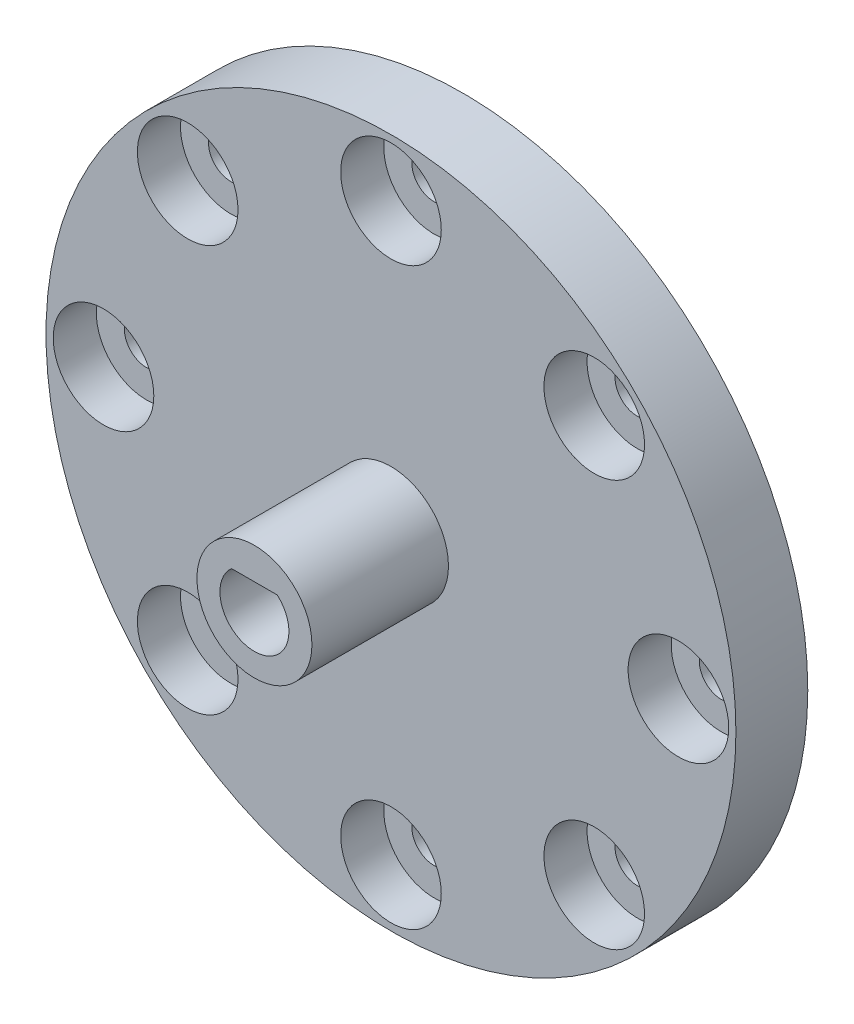
ISO-10303-21;
HEADER;
FILE_DESCRIPTION(('STEP AP214'),'2;1');
FILE_NAME('part.step','',(''),(''),'','','');
FILE_SCHEMA(('AUTOMOTIVE_DESIGN { 1 0 10303 214 1 1 1 1 }'));
ENDSEC;
DATA;
#1=APPLICATION_CONTEXT('core data for automotive mechanical design processes');
#2=APPLICATION_PROTOCOL_DEFINITION('international standard','automotive_design',2000,#1);
#3=PRODUCT_CONTEXT('',#1,'mechanical');
#4=PRODUCT('Part','Part','',(#3));
#5=PRODUCT_RELATED_PRODUCT_CATEGORY('part','',(#4));
#6=PRODUCT_DEFINITION_FORMATION('','',#4);
#7=PRODUCT_DEFINITION_CONTEXT('part definition',#1,'design');
#8=PRODUCT_DEFINITION('design','',#6,#7);
#9=PRODUCT_DEFINITION_SHAPE('','',#8);
#10=(LENGTH_UNIT() NAMED_UNIT(*) SI_UNIT(.MILLI.,.METRE.));
#11=(NAMED_UNIT(*) PLANE_ANGLE_UNIT() SI_UNIT($,.RADIAN.));
#12=(NAMED_UNIT(*) SI_UNIT($,.STERADIAN.) SOLID_ANGLE_UNIT());
#13=UNCERTAINTY_MEASURE_WITH_UNIT(LENGTH_MEASURE(1.E-05),#10,'distance_accuracy_value','');
#14=(GEOMETRIC_REPRESENTATION_CONTEXT(3) GLOBAL_UNCERTAINTY_ASSIGNED_CONTEXT((#13)) GLOBAL_UNIT_ASSIGNED_CONTEXT((#10,
#11,#12)) REPRESENTATION_CONTEXT('',''));
#15=CARTESIAN_POINT('',(0.,0.,0.));
#16=DIRECTION('',(0.,0.,1.));
#17=DIRECTION('',(1.,0.,0.));
#18=AXIS2_PLACEMENT_3D('',#15,#16,#17);
#19=CARTESIAN_POINT('',(14.1421356237307,14.1421356237303,9.38406204336157));
#20=DIRECTION('',(0.,0.,-1.));
#21=DIRECTION('',(-1.,0.,0.));
#22=AXIS2_PLACEMENT_3D('',#19,#20,#21);
#23=CYLINDRICAL_SURFACE('',#22,1.55000000000065);
#24=CARTESIAN_POINT('',(14.1421356237307,14.1421356237303,0.));
#25=DIRECTION('',(0.,0.,-1.));
#26=DIRECTION('',(-1.,0.,0.));
#27=AXIS2_PLACEMENT_3D('',#24,#25,#26);
#28=CIRCLE('',#27,1.55000000000065);
#29=CARTESIAN_POINT('',(12.5921356237301,14.1421356237303,0.));
#30=VERTEX_POINT('',#29);
#31=EDGE_CURVE('E137',#30,#30,#28,.T.);
#32=ORIENTED_EDGE('',*,*,#31,.T.);
#33=EDGE_LOOP('',(#32));
#34=FACE_BOUND('',#33,.T.);
#35=CARTESIAN_POINT('',(14.1421356237307,14.1421356237303,2.));
#36=DIRECTION('',(0.,0.,1.));
#37=DIRECTION('',(1.,0.,0.));
#38=AXIS2_PLACEMENT_3D('',#35,#36,#37);
#39=CIRCLE('',#38,1.55000000000065);
#40=CARTESIAN_POINT('',(15.6921356237314,14.1421356237303,2.));
#41=VERTEX_POINT('',#40);
#42=EDGE_CURVE('E41',#41,#41,#39,.F.);
#43=ORIENTED_EDGE('',*,*,#42,.F.);
#44=EDGE_LOOP('',(#43));
#45=FACE_BOUND('',#44,.T.);
#46=ADVANCED_FACE('F37',(#34,#45),#23,.F.);
#47=CARTESIAN_POINT('',(19.9999999999992,-8.5265128291212E-13,9.38406204336157));
#48=DIRECTION('',(0.,0.,-1.));
#49=DIRECTION('',(-1.,0.,0.));
#50=AXIS2_PLACEMENT_3D('',#47,#48,#49);
#51=CYLINDRICAL_SURFACE('',#50,1.55000000000126);
#52=CARTESIAN_POINT('',(19.9999999999992,-8.5265128291212E-13,0.));
#53=DIRECTION('',(0.,0.,-1.));
#54=DIRECTION('',(-1.,0.,0.));
#55=AXIS2_PLACEMENT_3D('',#52,#53,#54);
#56=CIRCLE('',#55,1.55000000000126);
#57=CARTESIAN_POINT('',(18.4499999999979,-8.5265128291212E-13,0.));
#58=VERTEX_POINT('',#57);
#59=EDGE_CURVE('E159',#58,#58,#56,.T.);
#60=ORIENTED_EDGE('',*,*,#59,.T.);
#61=EDGE_LOOP('',(#60));
#62=FACE_BOUND('',#61,.T.);
#63=CARTESIAN_POINT('',(19.9999999999992,-8.5265128291212E-13,2.));
#64=DIRECTION('',(0.,0.,1.));
#65=DIRECTION('',(1.,0.,0.));
#66=AXIS2_PLACEMENT_3D('',#63,#64,#65);
#67=CIRCLE('',#66,1.55000000000126);
#68=CARTESIAN_POINT('',(21.5500000000004,-8.5265128291212E-13,2.));
#69=VERTEX_POINT('',#68);
#70=EDGE_CURVE('E182',#69,#69,#67,.F.);
#71=ORIENTED_EDGE('',*,*,#70,.F.);
#72=EDGE_LOOP('',(#71));
#73=FACE_BOUND('',#72,.T.);
#74=ADVANCED_FACE('F192',(#62,#73),#51,.F.);
#75=CARTESIAN_POINT('',(14.1421356237295,-14.1421356237316,9.38406204336157));
#76=DIRECTION('',(0.,0.,-1.));
#77=DIRECTION('',(-1.,0.,0.));
#78=AXIS2_PLACEMENT_3D('',#75,#76,#77);
#79=CYLINDRICAL_SURFACE('',#78,1.55000000000173);
#80=CARTESIAN_POINT('',(14.1421356237295,-14.1421356237316,0.));
#81=DIRECTION('',(0.,0.,-1.));
#82=DIRECTION('',(-1.,0.,0.));
#83=AXIS2_PLACEMENT_3D('',#80,#81,#82);
#84=CIRCLE('',#83,1.55000000000173);
#85=CARTESIAN_POINT('',(12.5921356237278,-14.1421356237316,0.));
#86=VERTEX_POINT('',#85);
#87=EDGE_CURVE('E156',#86,#86,#84,.T.);
#88=ORIENTED_EDGE('',*,*,#87,.T.);
#89=EDGE_LOOP('',(#88));
#90=FACE_BOUND('',#89,.T.);
#91=CARTESIAN_POINT('',(14.1421356237295,-14.1421356237316,2.));
#92=DIRECTION('',(0.,0.,1.));
#93=DIRECTION('',(1.,0.,0.));
#94=AXIS2_PLACEMENT_3D('',#91,#92,#93);
#95=CIRCLE('',#94,1.55000000000173);
#96=CARTESIAN_POINT('',(15.6921356237312,-14.1421356237316,2.));
#97=VERTEX_POINT('',#96);
#98=EDGE_CURVE('E180',#97,#97,#95,.F.);
#99=ORIENTED_EDGE('',*,*,#98,.F.);
#100=EDGE_LOOP('',(#99));
#101=FACE_BOUND('',#100,.T.);
#102=ADVANCED_FACE('F198',(#90,#101),#79,.F.);
#103=CARTESIAN_POINT('',(-1.70040397862765E-12,-20.,9.38406204336157));
#104=DIRECTION('',(0.,0.,-1.));
#105=DIRECTION('',(-1.,0.,0.));
#106=AXIS2_PLACEMENT_3D('',#103,#104,#105);
#107=CYLINDRICAL_SURFACE('',#106,1.55000000000176);
#108=CARTESIAN_POINT('',(-1.70040397862765E-12,-20.,0.));
#109=DIRECTION('',(0.,0.,-1.));
#110=DIRECTION('',(-1.,0.,0.));
#111=AXIS2_PLACEMENT_3D('',#108,#109,#110);
#112=CIRCLE('',#111,1.55000000000176);
#113=CARTESIAN_POINT('',(-1.55000000000346,-20.,0.));
#114=VERTEX_POINT('',#113);
#115=EDGE_CURVE('E153',#114,#114,#112,.T.);
#116=ORIENTED_EDGE('',*,*,#115,.T.);
#117=EDGE_LOOP('',(#116));
#118=FACE_BOUND('',#117,.T.);
#119=CARTESIAN_POINT('',(-1.70040397862765E-12,-20.,2.));
#120=DIRECTION('',(0.,0.,1.));
#121=DIRECTION('',(1.,0.,0.));
#122=AXIS2_PLACEMENT_3D('',#119,#120,#121);
#123=CIRCLE('',#122,1.55000000000176);
#124=CARTESIAN_POINT('',(1.55000000000006,-20.,2.));
#125=VERTEX_POINT('',#124);
#126=EDGE_CURVE('E177',#125,#125,#123,.F.);
#127=ORIENTED_EDGE('',*,*,#126,.F.);
#128=EDGE_LOOP('',(#127));
#129=FACE_BOUND('',#128,.T.);
#130=ADVANCED_FACE('F259',(#118,#129),#107,.F.);
#131=CARTESIAN_POINT('',(-14.1421356237324,-14.1421356237303,9.38406204336157));
#132=DIRECTION('',(0.,0.,-1.));
#133=DIRECTION('',(-1.,0.,0.));
#134=AXIS2_PLACEMENT_3D('',#131,#132,#133);
#135=CYLINDRICAL_SURFACE('',#134,1.55000000000131);
#136=CARTESIAN_POINT('',(-14.1421356237324,-14.1421356237303,0.));
#137=DIRECTION('',(0.,0.,-1.));
#138=DIRECTION('',(-1.,0.,0.));
#139=AXIS2_PLACEMENT_3D('',#136,#137,#138);
#140=CIRCLE('',#139,1.55000000000131);
#141=CARTESIAN_POINT('',(-15.6921356237337,-14.1421356237303,0.));
#142=VERTEX_POINT('',#141);
#143=EDGE_CURVE('E150',#142,#142,#140,.T.);
#144=ORIENTED_EDGE('',*,*,#143,.T.);
#145=EDGE_LOOP('',(#144));
#146=FACE_BOUND('',#145,.T.);
#147=CARTESIAN_POINT('',(-14.1421356237324,-14.1421356237303,2.));
#148=DIRECTION('',(0.,0.,1.));
#149=DIRECTION('',(1.,0.,0.));
#150=AXIS2_PLACEMENT_3D('',#147,#148,#149);
#151=CIRCLE('',#150,1.55000000000131);
#152=CARTESIAN_POINT('',(-12.5921356237311,-14.1421356237303,2.));
#153=VERTEX_POINT('',#152);
#154=EDGE_CURVE('E174',#153,#153,#151,.F.);
#155=ORIENTED_EDGE('',*,*,#154,.F.);
#156=EDGE_LOOP('',(#155));
#157=FACE_BOUND('',#156,.T.);
#158=ADVANCED_FACE('F255',(#146,#157),#135,.F.);
#159=CARTESIAN_POINT('',(-20.0000000000008,8.50201989313825E-13,9.38406204336157));
#160=DIRECTION('',(0.,0.,-1.));
#161=DIRECTION('',(-1.,0.,0.));
#162=AXIS2_PLACEMENT_3D('',#159,#160,#161);
#163=CYLINDRICAL_SURFACE('',#162,1.55000000000063);
#164=CARTESIAN_POINT('',(-20.0000000000008,8.50201989313825E-13,0.));
#165=DIRECTION('',(0.,0.,-1.));
#166=DIRECTION('',(-1.,0.,0.));
#167=AXIS2_PLACEMENT_3D('',#164,#165,#166);
#168=CIRCLE('',#167,1.55000000000063);
#169=CARTESIAN_POINT('',(-21.5500000000015,8.50201989313825E-13,0.));
#170=VERTEX_POINT('',#169);
#171=EDGE_CURVE('E147',#170,#170,#168,.T.);
#172=ORIENTED_EDGE('',*,*,#171,.T.);
#173=EDGE_LOOP('',(#172));
#174=FACE_BOUND('',#173,.T.);
#175=CARTESIAN_POINT('',(-20.0000000000008,8.50201989313825E-13,2.));
#176=DIRECTION('',(0.,0.,1.));
#177=DIRECTION('',(1.,0.,0.));
#178=AXIS2_PLACEMENT_3D('',#175,#176,#177);
#179=CIRCLE('',#178,1.55000000000063);
#180=CARTESIAN_POINT('',(-18.4500000000002,8.50201989313825E-13,2.));
#181=VERTEX_POINT('',#180);
#182=EDGE_CURVE('E171',#181,#181,#179,.F.);
#183=ORIENTED_EDGE('',*,*,#182,.F.);
#184=EDGE_LOOP('',(#183));
#185=FACE_BOUND('',#184,.T.);
#186=ADVANCED_FACE('F247',(#174,#185),#163,.F.);
#187=CARTESIAN_POINT('',(-14.1421356237312,14.1421356237316,9.38406204336157));
#188=DIRECTION('',(0.,0.,-1.));
#189=DIRECTION('',(-1.,0.,0.));
#190=AXIS2_PLACEMENT_3D('',#187,#188,#189);
#191=CYLINDRICAL_SURFACE('',#190,1.5500000000001);
#192=CARTESIAN_POINT('',(-14.1421356237312,14.1421356237316,0.));
#193=DIRECTION('',(0.,0.,-1.));
#194=DIRECTION('',(-1.,0.,0.));
#195=AXIS2_PLACEMENT_3D('',#192,#193,#194);
#196=CIRCLE('',#195,1.5500000000001);
#197=CARTESIAN_POINT('',(-15.6921356237313,14.1421356237316,0.));
#198=VERTEX_POINT('',#197);
#199=EDGE_CURVE('E144',#198,#198,#196,.T.);
#200=ORIENTED_EDGE('',*,*,#199,.T.);
#201=EDGE_LOOP('',(#200));
#202=FACE_BOUND('',#201,.T.);
#203=CARTESIAN_POINT('',(-14.1421356237312,14.1421356237316,2.));
#204=DIRECTION('',(0.,0.,1.));
#205=DIRECTION('',(1.,0.,0.));
#206=AXIS2_PLACEMENT_3D('',#203,#204,#205);
#207=CIRCLE('',#206,1.5500000000001);
#208=CARTESIAN_POINT('',(-12.5921356237311,14.1421356237316,2.));
#209=VERTEX_POINT('',#208);
#210=EDGE_CURVE('E168',#209,#209,#207,.F.);
#211=ORIENTED_EDGE('',*,*,#210,.F.);
#212=EDGE_LOOP('',(#211));
#213=FACE_BOUND('',#212,.T.);
#214=ADVANCED_FACE('F239',(#202,#213),#191,.F.);
#215=CARTESIAN_POINT('',(0.,20.,9.38406204336157));
#216=DIRECTION('',(0.,0.,-1.));
#217=DIRECTION('',(-1.,0.,0.));
#218=AXIS2_PLACEMENT_3D('',#215,#216,#217);
#219=CYLINDRICAL_SURFACE('',#218,1.55);
#220=CARTESIAN_POINT('',(0.,20.,0.));
#221=DIRECTION('',(0.,0.,-1.));
#222=DIRECTION('',(-1.,0.,0.));
#223=AXIS2_PLACEMENT_3D('',#220,#221,#222);
#224=CIRCLE('',#223,1.55);
#225=CARTESIAN_POINT('',(-1.55,20.,0.));
#226=VERTEX_POINT('',#225);
#227=EDGE_CURVE('E141',#226,#226,#224,.T.);
#228=ORIENTED_EDGE('',*,*,#227,.T.);
#229=EDGE_LOOP('',(#228));
#230=FACE_BOUND('',#229,.T.);
#231=CARTESIAN_POINT('',(0.,20.,2.));
#232=DIRECTION('',(0.,0.,1.));
#233=DIRECTION('',(1.,0.,0.));
#234=AXIS2_PLACEMENT_3D('',#231,#232,#233);
#235=CIRCLE('',#234,1.55);
#236=CARTESIAN_POINT('',(1.55,20.,2.));
#237=VERTEX_POINT('',#236);
#238=EDGE_CURVE('E131',#237,#237,#235,.F.);
#239=ORIENTED_EDGE('',*,*,#238,.F.);
#240=EDGE_LOOP('',(#239));
#241=FACE_BOUND('',#240,.T.);
#242=ADVANCED_FACE('F234',(#230,#241),#219,.F.);
#243=CARTESIAN_POINT('',(0.,0.,5.));
#244=DIRECTION('',(0.,0.,-1.));
#245=DIRECTION('',(-1.,0.,0.));
#246=AXIS2_PLACEMENT_3D('',#243,#244,#245);
#247=CYLINDRICAL_SURFACE('',#246,24.);
#248=CARTESIAN_POINT('',(0.,0.,5.));
#249=DIRECTION('',(0.,0.,1.));
#250=DIRECTION('',(1.,0.,0.));
#251=AXIS2_PLACEMENT_3D('',#248,#249,#250);
#252=CIRCLE('',#251,24.);
#253=CARTESIAN_POINT('',(24.,0.,5.));
#254=VERTEX_POINT('',#253);
#255=EDGE_CURVE('E11',#254,#254,#252,.T.);
#256=ORIENTED_EDGE('',*,*,#255,.F.);
#257=EDGE_LOOP('',(#256));
#258=FACE_BOUND('',#257,.T.);
#259=CARTESIAN_POINT('',(0.,0.,0.));
#260=DIRECTION('',(0.,0.,1.));
#261=DIRECTION('',(1.,0.,0.));
#262=AXIS2_PLACEMENT_3D('',#259,#260,#261);
#263=CIRCLE('',#262,24.);
#264=CARTESIAN_POINT('',(24.,0.,0.));
#265=VERTEX_POINT('',#264);
#266=EDGE_CURVE('E46',#265,#265,#263,.T.);
#267=ORIENTED_EDGE('',*,*,#266,.T.);
#268=EDGE_LOOP('',(#267));
#269=FACE_BOUND('',#268,.T.);
#270=ADVANCED_FACE('F39',(#258,#269),#247,.T.);
#271=CARTESIAN_POINT('',(0.,0.,5.));
#272=DIRECTION('',(0.,0.,1.));
#273=DIRECTION('',(1.,0.,0.));
#274=AXIS2_PLACEMENT_3D('',#271,#272,#273);
#275=PLANE('',#274);
#276=CARTESIAN_POINT('',(-14.1421356237307,14.1421356237303,5.));
#277=DIRECTION('',(0.,0.,1.));
#278=DIRECTION('',(1.,0.,0.));
#279=AXIS2_PLACEMENT_3D('',#276,#277,#278);
#280=CIRCLE('',#279,3.50000000000065);
#281=CARTESIAN_POINT('',(-10.6421356237301,14.1421356237303,5.));
#282=VERTEX_POINT('',#281);
#283=EDGE_CURVE('E70',#282,#282,#280,.T.);
#284=ORIENTED_EDGE('',*,*,#283,.F.);
#285=EDGE_LOOP('',(#284));
#286=FACE_BOUND('',#285,.T.);
#287=CARTESIAN_POINT('',(-19.9999999999992,-8.5265128291212E-13,5.));
#288=DIRECTION('',(0.,0.,1.));
#289=DIRECTION('',(1.,0.,0.));
#290=AXIS2_PLACEMENT_3D('',#287,#288,#289);
#291=CIRCLE('',#290,3.50000000000126);
#292=CARTESIAN_POINT('',(-16.4999999999979,-8.5265128291212E-13,5.));
#293=VERTEX_POINT('',#292);
#294=EDGE_CURVE('E120',#293,#293,#291,.T.);
#295=ORIENTED_EDGE('',*,*,#294,.F.);
#296=EDGE_LOOP('',(#295));
#297=FACE_BOUND('',#296,.T.);
#298=CARTESIAN_POINT('',(-14.1421356237295,-14.1421356237316,5.));
#299=DIRECTION('',(0.,0.,1.));
#300=DIRECTION('',(1.,0.,0.));
#301=AXIS2_PLACEMENT_3D('',#298,#299,#300);
#302=CIRCLE('',#301,3.50000000000173);
#303=CARTESIAN_POINT('',(-10.6421356237278,-14.1421356237316,5.));
#304=VERTEX_POINT('',#303);
#305=EDGE_CURVE('E114',#304,#304,#302,.T.);
#306=ORIENTED_EDGE('',*,*,#305,.F.);
#307=EDGE_LOOP('',(#306));
#308=FACE_BOUND('',#307,.T.);
#309=CARTESIAN_POINT('',(1.70040397862765E-12,-20.,5.));
#310=DIRECTION('',(0.,0.,1.));
#311=DIRECTION('',(1.,0.,0.));
#312=AXIS2_PLACEMENT_3D('',#309,#310,#311);
#313=CIRCLE('',#312,3.50000000000176);
#314=CARTESIAN_POINT('',(3.50000000000346,-20.,5.));
#315=VERTEX_POINT('',#314);
#316=EDGE_CURVE('E108',#315,#315,#313,.T.);
#317=ORIENTED_EDGE('',*,*,#316,.F.);
#318=EDGE_LOOP('',(#317));
#319=FACE_BOUND('',#318,.T.);
#320=CARTESIAN_POINT('',(14.1421356237324,-14.1421356237303,5.));
#321=DIRECTION('',(0.,0.,1.));
#322=DIRECTION('',(1.,0.,0.));
#323=AXIS2_PLACEMENT_3D('',#320,#321,#322);
#324=CIRCLE('',#323,3.50000000000131);
#325=CARTESIAN_POINT('',(17.6421356237337,-14.1421356237303,5.));
#326=VERTEX_POINT('',#325);
#327=EDGE_CURVE('E102',#326,#326,#324,.T.);
#328=ORIENTED_EDGE('',*,*,#327,.F.);
#329=EDGE_LOOP('',(#328));
#330=FACE_BOUND('',#329,.T.);
#331=CARTESIAN_POINT('',(20.0000000000008,8.50201989313825E-13,5.));
#332=DIRECTION('',(0.,0.,1.));
#333=DIRECTION('',(1.,0.,0.));
#334=AXIS2_PLACEMENT_3D('',#331,#332,#333);
#335=CIRCLE('',#334,3.50000000000063);
#336=CARTESIAN_POINT('',(23.5000000000015,8.50201989313825E-13,5.));
#337=VERTEX_POINT('',#336);
#338=EDGE_CURVE('E96',#337,#337,#335,.T.);
#339=ORIENTED_EDGE('',*,*,#338,.F.);
#340=EDGE_LOOP('',(#339));
#341=FACE_BOUND('',#340,.T.);
#342=CARTESIAN_POINT('',(14.1421356237312,14.1421356237316,5.));
#343=DIRECTION('',(0.,0.,1.));
#344=DIRECTION('',(1.,0.,0.));
#345=AXIS2_PLACEMENT_3D('',#342,#343,#344);
#346=CIRCLE('',#345,3.5000000000001);
#347=CARTESIAN_POINT('',(17.6421356237313,14.1421356237316,5.));
#348=VERTEX_POINT('',#347);
#349=EDGE_CURVE('E90',#348,#348,#346,.T.);
#350=ORIENTED_EDGE('',*,*,#349,.F.);
#351=EDGE_LOOP('',(#350));
#352=FACE_BOUND('',#351,.T.);
#353=CARTESIAN_POINT('',(0.,20.,5.));
#354=DIRECTION('',(0.,0.,1.));
#355=DIRECTION('',(1.,0.,0.));
#356=AXIS2_PLACEMENT_3D('',#353,#354,#355);
#357=CIRCLE('',#356,3.5);
#358=CARTESIAN_POINT('',(3.5,20.,5.));
#359=VERTEX_POINT('',#358);
#360=EDGE_CURVE('E89',#359,#359,#357,.T.);
#361=ORIENTED_EDGE('',*,*,#360,.F.);
#362=EDGE_LOOP('',(#361));
#363=FACE_BOUND('',#362,.T.);
#364=CARTESIAN_POINT('',(0.,0.,5.));
#365=DIRECTION('',(0.,0.,1.));
#366=DIRECTION('',(1.,0.,0.));
#367=AXIS2_PLACEMENT_3D('',#364,#365,#366);
#368=CIRCLE('',#367,4.);
#369=CARTESIAN_POINT('',(4.,0.,5.));
#370=VERTEX_POINT('',#369);
#371=EDGE_CURVE('E138',#370,#370,#368,.T.);
#372=ORIENTED_EDGE('',*,*,#371,.F.);
#373=EDGE_LOOP('',(#372));
#374=FACE_BOUND('',#373,.T.);
#375=ORIENTED_EDGE('',*,*,#255,.T.);
#376=EDGE_LOOP('',(#375));
#377=FACE_BOUND('',#376,.T.);
#378=ADVANCED_FACE('F203',(#286,#297,#308,#319,#330,#341,#352,#363,#374,#377),#275,.T.);
#379=CARTESIAN_POINT('',(0.,0.,0.));
#380=DIRECTION('',(0.,0.,1.));
#381=DIRECTION('',(1.,0.,0.));
#382=AXIS2_PLACEMENT_3D('',#379,#380,#381);
#383=PLANE('',#382);
#384=ORIENTED_EDGE('',*,*,#227,.F.);
#385=EDGE_LOOP('',(#384));
#386=FACE_BOUND('',#385,.T.);
#387=ORIENTED_EDGE('',*,*,#199,.F.);
#388=EDGE_LOOP('',(#387));
#389=FACE_BOUND('',#388,.T.);
#390=ORIENTED_EDGE('',*,*,#171,.F.);
#391=EDGE_LOOP('',(#390));
#392=FACE_BOUND('',#391,.T.);
#393=ORIENTED_EDGE('',*,*,#143,.F.);
#394=EDGE_LOOP('',(#393));
#395=FACE_BOUND('',#394,.T.);
#396=ORIENTED_EDGE('',*,*,#115,.F.);
#397=EDGE_LOOP('',(#396));
#398=FACE_BOUND('',#397,.T.);
#399=ORIENTED_EDGE('',*,*,#87,.F.);
#400=EDGE_LOOP('',(#399));
#401=FACE_BOUND('',#400,.T.);
#402=ORIENTED_EDGE('',*,*,#59,.F.);
#403=EDGE_LOOP('',(#402));
#404=FACE_BOUND('',#403,.T.);
#405=ORIENTED_EDGE('',*,*,#31,.F.);
#406=EDGE_LOOP('',(#405));
#407=FACE_BOUND('',#406,.T.);
#408=ORIENTED_EDGE('',*,*,#266,.F.);
#409=EDGE_LOOP('',(#408));
#410=FACE_BOUND('',#409,.T.);
#411=ADVANCED_FACE('F205',(#386,#389,#392,#395,#398,#401,#404,#407,#410),#383,.F.);
#412=CARTESIAN_POINT('',(0.,0.,14.5));
#413=DIRECTION('',(0.,0.,-1.));
#414=DIRECTION('',(-1.,0.,0.));
#415=AXIS2_PLACEMENT_3D('',#412,#413,#414);
#416=CYLINDRICAL_SURFACE('',#415,4.);
#417=CARTESIAN_POINT('',(0.,0.,14.5));
#418=DIRECTION('',(0.,0.,1.));
#419=DIRECTION('',(1.,0.,0.));
#420=AXIS2_PLACEMENT_3D('',#417,#418,#419);
#421=CIRCLE('',#420,4.);
#422=CARTESIAN_POINT('',(4.,0.,14.5));
#423=VERTEX_POINT('',#422);
#424=EDGE_CURVE('E134',#423,#423,#421,.T.);
#425=ORIENTED_EDGE('',*,*,#424,.F.);
#426=EDGE_LOOP('',(#425));
#427=FACE_BOUND('',#426,.T.);
#428=ORIENTED_EDGE('',*,*,#371,.T.);
#429=EDGE_LOOP('',(#428));
#430=FACE_BOUND('',#429,.T.);
#431=ADVANCED_FACE('F208',(#427,#430),#416,.T.);
#432=CARTESIAN_POINT('',(0.,0.,14.5));
#433=DIRECTION('',(0.,0.,1.));
#434=DIRECTION('',(1.,0.,0.));
#435=AXIS2_PLACEMENT_3D('',#432,#433,#434);
#436=PLANE('',#435);
#437=CARTESIAN_POINT('',(0.,0.,14.5));
#438=DIRECTION('',(0.,0.,1.));
#439=DIRECTION('',(1.,0.,0.));
#440=AXIS2_PLACEMENT_3D('',#437,#438,#439);
#441=CIRCLE('',#440,2.4);
#442=CARTESIAN_POINT('',(-1.58745078663875,1.8,14.5));
#443=VERTEX_POINT('',#442);
#444=CARTESIAN_POINT('',(1.58745078663875,1.8,14.5));
#445=VERTEX_POINT('',#444);
#446=EDGE_CURVE('E54',#443,#445,#441,.T.);
#447=ORIENTED_EDGE('',*,*,#446,.F.);
#448=DIRECTION('',(-1.,0.,0.));
#449=VECTOR('',#448,1.);
#450=CARTESIAN_POINT('',(-1.58745078663875,1.8,14.5));
#451=LINE('',#450,#449);
#452=EDGE_CURVE('E74',#445,#443,#451,.T.);
#453=ORIENTED_EDGE('',*,*,#452,.F.);
#454=EDGE_LOOP('',(#447,#453));
#455=FACE_BOUND('',#454,.T.);
#456=ORIENTED_EDGE('',*,*,#424,.T.);
#457=EDGE_LOOP('',(#456));
#458=FACE_BOUND('',#457,.T.);
#459=ADVANCED_FACE('F78',(#455,#458),#436,.T.);
#460=CARTESIAN_POINT('',(0.,20.,2.));
#461=DIRECTION('',(0.,0.,1.));
#462=DIRECTION('',(1.,0.,0.));
#463=AXIS2_PLACEMENT_3D('',#460,#461,#462);
#464=PLANE('',#463);
#465=CARTESIAN_POINT('',(0.,20.,2.));
#466=DIRECTION('',(0.,0.,1.));
#467=DIRECTION('',(1.,0.,0.));
#468=AXIS2_PLACEMENT_3D('',#465,#466,#467);
#469=CIRCLE('',#468,3.5);
#470=CARTESIAN_POINT('',(3.5,20.,2.));
#471=VERTEX_POINT('',#470);
#472=EDGE_CURVE('E128',#471,#471,#469,.T.);
#473=ORIENTED_EDGE('',*,*,#472,.T.);
#474=EDGE_LOOP('',(#473));
#475=FACE_BOUND('',#474,.T.);
#476=ORIENTED_EDGE('',*,*,#238,.T.);
#477=EDGE_LOOP('',(#476));
#478=FACE_BOUND('',#477,.T.);
#479=ADVANCED_FACE('F318',(#475,#478),#464,.T.);
#480=CARTESIAN_POINT('',(0.,20.,2.));
#481=DIRECTION('',(0.,0.,1.));
#482=DIRECTION('',(1.,0.,0.));
#483=AXIS2_PLACEMENT_3D('',#480,#481,#482);
#484=CYLINDRICAL_SURFACE('',#483,3.5);
#485=ORIENTED_EDGE('',*,*,#472,.F.);
#486=EDGE_LOOP('',(#485));
#487=FACE_BOUND('',#486,.T.);
#488=ORIENTED_EDGE('',*,*,#360,.T.);
#489=EDGE_LOOP('',(#488));
#490=FACE_BOUND('',#489,.T.);
#491=ADVANCED_FACE('F313',(#487,#490),#484,.F.);
#492=CARTESIAN_POINT('',(-14.1421356237307,14.1421356237303,2.));
#493=DIRECTION('',(0.,0.,1.));
#494=DIRECTION('',(1.,0.,0.));
#495=AXIS2_PLACEMENT_3D('',#492,#493,#494);
#496=PLANE('',#495);
#497=CARTESIAN_POINT('',(-14.1421356237307,14.1421356237303,2.));
#498=DIRECTION('',(0.,0.,1.));
#499=DIRECTION('',(1.,0.,0.));
#500=AXIS2_PLACEMENT_3D('',#497,#498,#499);
#501=CIRCLE('',#500,3.50000000000065);
#502=CARTESIAN_POINT('',(-10.6421356237301,14.1421356237303,2.));
#503=VERTEX_POINT('',#502);
#504=EDGE_CURVE('E123',#503,#503,#501,.T.);
#505=ORIENTED_EDGE('',*,*,#504,.T.);
#506=EDGE_LOOP('',(#505));
#507=FACE_BOUND('',#506,.T.);
#508=ORIENTED_EDGE('',*,*,#210,.T.);
#509=EDGE_LOOP('',(#508));
#510=FACE_BOUND('',#509,.T.);
#511=ADVANCED_FACE('F310',(#507,#510),#496,.T.);
#512=CARTESIAN_POINT('',(-14.1421356237307,14.1421356237303,2.));
#513=DIRECTION('',(0.,0.,1.));
#514=DIRECTION('',(1.,0.,0.));
#515=AXIS2_PLACEMENT_3D('',#512,#513,#514);
#516=CYLINDRICAL_SURFACE('',#515,3.50000000000065);
#517=ORIENTED_EDGE('',*,*,#504,.F.);
#518=EDGE_LOOP('',(#517));
#519=FACE_BOUND('',#518,.T.);
#520=ORIENTED_EDGE('',*,*,#283,.T.);
#521=EDGE_LOOP('',(#520));
#522=FACE_BOUND('',#521,.T.);
#523=ADVANCED_FACE('F305',(#519,#522),#516,.F.);
#524=CARTESIAN_POINT('',(-19.9999999999992,-8.5265128291212E-13,2.));
#525=DIRECTION('',(0.,0.,1.));
#526=DIRECTION('',(1.,0.,0.));
#527=AXIS2_PLACEMENT_3D('',#524,#525,#526);
#528=PLANE('',#527);
#529=CARTESIAN_POINT('',(-19.9999999999992,-8.5265128291212E-13,2.));
#530=DIRECTION('',(0.,0.,1.));
#531=DIRECTION('',(1.,0.,0.));
#532=AXIS2_PLACEMENT_3D('',#529,#530,#531);
#533=CIRCLE('',#532,3.50000000000126);
#534=CARTESIAN_POINT('',(-16.4999999999979,-8.5265128291212E-13,2.));
#535=VERTEX_POINT('',#534);
#536=EDGE_CURVE('E117',#535,#535,#533,.T.);
#537=ORIENTED_EDGE('',*,*,#536,.T.);
#538=EDGE_LOOP('',(#537));
#539=FACE_BOUND('',#538,.T.);
#540=ORIENTED_EDGE('',*,*,#182,.T.);
#541=EDGE_LOOP('',(#540));
#542=FACE_BOUND('',#541,.T.);
#543=ADVANCED_FACE('F302',(#539,#542),#528,.T.);
#544=CARTESIAN_POINT('',(-19.9999999999992,-8.5265128291212E-13,2.));
#545=DIRECTION('',(0.,0.,1.));
#546=DIRECTION('',(1.,0.,0.));
#547=AXIS2_PLACEMENT_3D('',#544,#545,#546);
#548=CYLINDRICAL_SURFACE('',#547,3.50000000000126);
#549=ORIENTED_EDGE('',*,*,#536,.F.);
#550=EDGE_LOOP('',(#549));
#551=FACE_BOUND('',#550,.T.);
#552=ORIENTED_EDGE('',*,*,#294,.T.);
#553=EDGE_LOOP('',(#552));
#554=FACE_BOUND('',#553,.T.);
#555=ADVANCED_FACE('F297',(#551,#554),#548,.F.);
#556=CARTESIAN_POINT('',(-14.1421356237295,-14.1421356237316,2.));
#557=DIRECTION('',(0.,0.,1.));
#558=DIRECTION('',(1.,0.,0.));
#559=AXIS2_PLACEMENT_3D('',#556,#557,#558);
#560=PLANE('',#559);
#561=CARTESIAN_POINT('',(-14.1421356237295,-14.1421356237316,2.));
#562=DIRECTION('',(0.,0.,1.));
#563=DIRECTION('',(1.,0.,0.));
#564=AXIS2_PLACEMENT_3D('',#561,#562,#563);
#565=CIRCLE('',#564,3.50000000000173);
#566=CARTESIAN_POINT('',(-10.6421356237278,-14.1421356237316,2.));
#567=VERTEX_POINT('',#566);
#568=EDGE_CURVE('E111',#567,#567,#565,.T.);
#569=ORIENTED_EDGE('',*,*,#568,.T.);
#570=EDGE_LOOP('',(#569));
#571=FACE_BOUND('',#570,.T.);
#572=ORIENTED_EDGE('',*,*,#154,.T.);
#573=EDGE_LOOP('',(#572));
#574=FACE_BOUND('',#573,.T.);
#575=ADVANCED_FACE('F294',(#571,#574),#560,.T.);
#576=CARTESIAN_POINT('',(-14.1421356237295,-14.1421356237316,2.));
#577=DIRECTION('',(0.,0.,1.));
#578=DIRECTION('',(1.,0.,0.));
#579=AXIS2_PLACEMENT_3D('',#576,#577,#578);
#580=CYLINDRICAL_SURFACE('',#579,3.50000000000173);
#581=ORIENTED_EDGE('',*,*,#568,.F.);
#582=EDGE_LOOP('',(#581));
#583=FACE_BOUND('',#582,.T.);
#584=ORIENTED_EDGE('',*,*,#305,.T.);
#585=EDGE_LOOP('',(#584));
#586=FACE_BOUND('',#585,.T.);
#587=ADVANCED_FACE('F291',(#583,#586),#580,.F.);
#588=CARTESIAN_POINT('',(1.70040397862765E-12,-20.,2.));
#589=DIRECTION('',(0.,0.,1.));
#590=DIRECTION('',(1.,0.,0.));
#591=AXIS2_PLACEMENT_3D('',#588,#589,#590);
#592=PLANE('',#591);
#593=CARTESIAN_POINT('',(1.70040397862765E-12,-20.,2.));
#594=DIRECTION('',(0.,0.,1.));
#595=DIRECTION('',(1.,0.,0.));
#596=AXIS2_PLACEMENT_3D('',#593,#594,#595);
#597=CIRCLE('',#596,3.50000000000176);
#598=CARTESIAN_POINT('',(3.50000000000346,-20.,2.));
#599=VERTEX_POINT('',#598);
#600=EDGE_CURVE('E105',#599,#599,#597,.T.);
#601=ORIENTED_EDGE('',*,*,#600,.T.);
#602=EDGE_LOOP('',(#601));
#603=FACE_BOUND('',#602,.T.);
#604=ORIENTED_EDGE('',*,*,#126,.T.);
#605=EDGE_LOOP('',(#604));
#606=FACE_BOUND('',#605,.T.);
#607=ADVANCED_FACE('F283',(#603,#606),#592,.T.);
#608=CARTESIAN_POINT('',(1.70040397862765E-12,-20.,2.));
#609=DIRECTION('',(0.,0.,1.));
#610=DIRECTION('',(1.,0.,0.));
#611=AXIS2_PLACEMENT_3D('',#608,#609,#610);
#612=CYLINDRICAL_SURFACE('',#611,3.50000000000176);
#613=ORIENTED_EDGE('',*,*,#600,.F.);
#614=EDGE_LOOP('',(#613));
#615=FACE_BOUND('',#614,.T.);
#616=ORIENTED_EDGE('',*,*,#316,.T.);
#617=EDGE_LOOP('',(#616));
#618=FACE_BOUND('',#617,.T.);
#619=ADVANCED_FACE('F273',(#615,#618),#612,.F.);
#620=CARTESIAN_POINT('',(14.1421356237324,-14.1421356237303,2.));
#621=DIRECTION('',(0.,0.,1.));
#622=DIRECTION('',(1.,0.,0.));
#623=AXIS2_PLACEMENT_3D('',#620,#621,#622);
#624=PLANE('',#623);
#625=CARTESIAN_POINT('',(14.1421356237324,-14.1421356237303,2.));
#626=DIRECTION('',(0.,0.,1.));
#627=DIRECTION('',(1.,0.,0.));
#628=AXIS2_PLACEMENT_3D('',#625,#626,#627);
#629=CIRCLE('',#628,3.50000000000131);
#630=CARTESIAN_POINT('',(17.6421356237337,-14.1421356237303,2.));
#631=VERTEX_POINT('',#630);
#632=EDGE_CURVE('E99',#631,#631,#629,.T.);
#633=ORIENTED_EDGE('',*,*,#632,.T.);
#634=EDGE_LOOP('',(#633));
#635=FACE_BOUND('',#634,.T.);
#636=ORIENTED_EDGE('',*,*,#98,.T.);
#637=EDGE_LOOP('',(#636));
#638=FACE_BOUND('',#637,.T.);
#639=ADVANCED_FACE('F270',(#635,#638),#624,.T.);
#640=CARTESIAN_POINT('',(14.1421356237324,-14.1421356237303,2.));
#641=DIRECTION('',(0.,0.,1.));
#642=DIRECTION('',(1.,0.,0.));
#643=AXIS2_PLACEMENT_3D('',#640,#641,#642);
#644=CYLINDRICAL_SURFACE('',#643,3.50000000000131);
#645=ORIENTED_EDGE('',*,*,#632,.F.);
#646=EDGE_LOOP('',(#645));
#647=FACE_BOUND('',#646,.T.);
#648=ORIENTED_EDGE('',*,*,#327,.T.);
#649=EDGE_LOOP('',(#648));
#650=FACE_BOUND('',#649,.T.);
#651=ADVANCED_FACE('F272',(#647,#650),#644,.F.);
#652=CARTESIAN_POINT('',(20.0000000000008,8.50201989313825E-13,2.));
#653=DIRECTION('',(0.,0.,1.));
#654=DIRECTION('',(1.,0.,0.));
#655=AXIS2_PLACEMENT_3D('',#652,#653,#654);
#656=PLANE('',#655);
#657=CARTESIAN_POINT('',(20.0000000000008,8.50201989313825E-13,2.));
#658=DIRECTION('',(0.,0.,1.));
#659=DIRECTION('',(1.,0.,0.));
#660=AXIS2_PLACEMENT_3D('',#657,#658,#659);
#661=CIRCLE('',#660,3.50000000000063);
#662=CARTESIAN_POINT('',(23.5000000000015,8.50201989313825E-13,2.));
#663=VERTEX_POINT('',#662);
#664=EDGE_CURVE('E93',#663,#663,#661,.T.);
#665=ORIENTED_EDGE('',*,*,#664,.T.);
#666=EDGE_LOOP('',(#665));
#667=FACE_BOUND('',#666,.T.);
#668=ORIENTED_EDGE('',*,*,#70,.T.);
#669=EDGE_LOOP('',(#668));
#670=FACE_BOUND('',#669,.T.);
#671=ADVANCED_FACE('F280',(#667,#670),#656,.T.);
#672=CARTESIAN_POINT('',(20.0000000000008,8.50201989313825E-13,2.));
#673=DIRECTION('',(0.,0.,1.));
#674=DIRECTION('',(1.,0.,0.));
#675=AXIS2_PLACEMENT_3D('',#672,#673,#674);
#676=CYLINDRICAL_SURFACE('',#675,3.50000000000063);
#677=ORIENTED_EDGE('',*,*,#664,.F.);
#678=EDGE_LOOP('',(#677));
#679=FACE_BOUND('',#678,.T.);
#680=ORIENTED_EDGE('',*,*,#338,.T.);
#681=EDGE_LOOP('',(#680));
#682=FACE_BOUND('',#681,.T.);
#683=ADVANCED_FACE('F287',(#679,#682),#676,.F.);
#684=CARTESIAN_POINT('',(14.1421356237312,14.1421356237316,2.));
#685=DIRECTION('',(0.,0.,1.));
#686=DIRECTION('',(1.,0.,0.));
#687=AXIS2_PLACEMENT_3D('',#684,#685,#686);
#688=PLANE('',#687);
#689=CARTESIAN_POINT('',(14.1421356237312,14.1421356237316,2.));
#690=DIRECTION('',(0.,0.,1.));
#691=DIRECTION('',(1.,0.,0.));
#692=AXIS2_PLACEMENT_3D('',#689,#690,#691);
#693=CIRCLE('',#692,3.5000000000001);
#694=CARTESIAN_POINT('',(17.6421356237313,14.1421356237316,2.));
#695=VERTEX_POINT('',#694);
#696=EDGE_CURVE('E86',#695,#695,#693,.T.);
#697=ORIENTED_EDGE('',*,*,#696,.T.);
#698=EDGE_LOOP('',(#697));
#699=FACE_BOUND('',#698,.T.);
#700=ORIENTED_EDGE('',*,*,#42,.T.);
#701=EDGE_LOOP('',(#700));
#702=FACE_BOUND('',#701,.T.);
#703=ADVANCED_FACE('F189',(#699,#702),#688,.T.);
#704=CARTESIAN_POINT('',(14.1421356237312,14.1421356237316,2.));
#705=DIRECTION('',(0.,0.,1.));
#706=DIRECTION('',(1.,0.,0.));
#707=AXIS2_PLACEMENT_3D('',#704,#705,#706);
#708=CYLINDRICAL_SURFACE('',#707,3.5000000000001);
#709=ORIENTED_EDGE('',*,*,#696,.F.);
#710=EDGE_LOOP('',(#709));
#711=FACE_BOUND('',#710,.T.);
#712=ORIENTED_EDGE('',*,*,#349,.T.);
#713=EDGE_LOOP('',(#712));
#714=FACE_BOUND('',#713,.T.);
#715=ADVANCED_FACE('F406',(#711,#714),#708,.F.);
#716=CARTESIAN_POINT('',(0.,0.,6.5));
#717=DIRECTION('',(0.,0.,1.));
#718=DIRECTION('',(1.,0.,0.));
#719=AXIS2_PLACEMENT_3D('',#716,#717,#718);
#720=CYLINDRICAL_SURFACE('',#719,2.4);
#721=ORIENTED_EDGE('',*,*,#446,.T.);
#722=DIRECTION('',(0.,0.,1.));
#723=VECTOR('',#722,1.);
#724=CARTESIAN_POINT('',(1.58745078663875,1.8,6.5));
#725=LINE('',#724,#723);
#726=CARTESIAN_POINT('',(1.58745078663875,1.8,6.5));
#727=VERTEX_POINT('',#726);
#728=EDGE_CURVE('E71',#727,#445,#725,.T.);
#729=ORIENTED_EDGE('',*,*,#728,.F.);
#730=CARTESIAN_POINT('',(0.,0.,6.5));
#731=DIRECTION('',(0.,0.,1.));
#732=DIRECTION('',(1.,0.,0.));
#733=AXIS2_PLACEMENT_3D('',#730,#731,#732);
#734=CIRCLE('',#733,2.4);
#735=CARTESIAN_POINT('',(-1.58745078663875,1.8,6.5));
#736=VERTEX_POINT('',#735);
#737=EDGE_CURVE('E68',#736,#727,#734,.T.);
#738=ORIENTED_EDGE('',*,*,#737,.F.);
#739=DIRECTION('',(0.,0.,1.));
#740=VECTOR('',#739,1.);
#741=CARTESIAN_POINT('',(-1.58745078663875,1.8,6.5));
#742=LINE('',#741,#740);
#743=EDGE_CURVE('E62',#736,#443,#742,.T.);
#744=ORIENTED_EDGE('',*,*,#743,.T.);
#745=EDGE_LOOP('',(#721,#729,#738,#744));
#746=FACE_BOUND('',#745,.T.);
#747=ADVANCED_FACE('F66',(#746),#720,.F.);
#748=CARTESIAN_POINT('',(-1.58745078663875,1.8,6.5));
#749=DIRECTION('',(0.,1.,0.));
#750=DIRECTION('',(0.,0.,1.));
#751=AXIS2_PLACEMENT_3D('',#748,#749,#750);
#752=PLANE('',#751);
#753=ORIENTED_EDGE('',*,*,#452,.T.);
#754=ORIENTED_EDGE('',*,*,#743,.F.);
#755=DIRECTION('',(-1.,0.,0.));
#756=VECTOR('',#755,1.);
#757=CARTESIAN_POINT('',(-1.58745078663875,1.8,6.5));
#758=LINE('',#757,#756);
#759=EDGE_CURVE('E82',#727,#736,#758,.T.);
#760=ORIENTED_EDGE('',*,*,#759,.F.);
#761=ORIENTED_EDGE('',*,*,#728,.T.);
#762=EDGE_LOOP('',(#753,#754,#760,#761));
#763=FACE_BOUND('',#762,.T.);
#764=ADVANCED_FACE('F75',(#763),#752,.F.);
#765=CARTESIAN_POINT('',(0.,0.,6.5));
#766=DIRECTION('',(0.,0.,1.));
#767=DIRECTION('',(1.,0.,0.));
#768=AXIS2_PLACEMENT_3D('',#765,#766,#767);
#769=PLANE('',#768);
#770=ORIENTED_EDGE('',*,*,#737,.T.);
#771=ORIENTED_EDGE('',*,*,#759,.T.);
#772=EDGE_LOOP('',(#770,#771));
#773=FACE_BOUND('',#772,.T.);
#774=ADVANCED_FACE('F429',(#773),#769,.T.);
#775=CLOSED_SHELL('',(#46,#74,#102,#130,#158,#186,#214,#242,#270,#378,#411,#431,#459,#479,#491,
#511,#523,#543,#555,#575,#587,#607,#619,#639,#651,#671,#683,#703,#715,#747,#764,#774));
#776=MANIFOLD_SOLID_BREP('B2',#775);
#777=ADVANCED_BREP_SHAPE_REPRESENTATION('',(#18,#776),#14);
#778=SHAPE_DEFINITION_REPRESENTATION(#9,#777);
ENDSEC;
END-ISO-10303-21;
